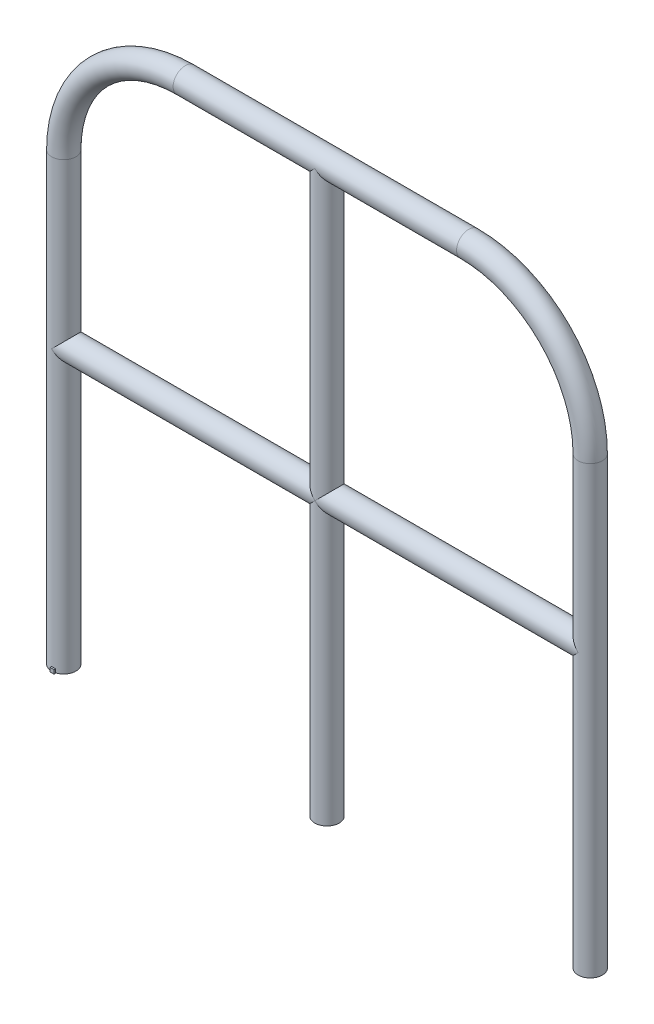
ISO-10303-21;
HEADER;
FILE_DESCRIPTION(('STEP AP214'),'2;1');
FILE_NAME('part.step','',(''),(''),'','','');
FILE_SCHEMA(('AUTOMOTIVE_DESIGN { 1 0 10303 214 1 1 1 1 }'));
ENDSEC;
DATA;
#1=APPLICATION_CONTEXT('core data for automotive mechanical design processes');
#2=APPLICATION_PROTOCOL_DEFINITION('international standard','automotive_design',2000,#1);
#3=PRODUCT_CONTEXT('',#1,'mechanical');
#4=PRODUCT('Part','Part','',(#3));
#5=PRODUCT_RELATED_PRODUCT_CATEGORY('part','',(#4));
#6=PRODUCT_DEFINITION_FORMATION('','',#4);
#7=PRODUCT_DEFINITION_CONTEXT('part definition',#1,'design');
#8=PRODUCT_DEFINITION('design','',#6,#7);
#9=PRODUCT_DEFINITION_SHAPE('','',#8);
#10=(LENGTH_UNIT() NAMED_UNIT(*) SI_UNIT(.MILLI.,.METRE.));
#11=(NAMED_UNIT(*) PLANE_ANGLE_UNIT() SI_UNIT($,.RADIAN.));
#12=(NAMED_UNIT(*) SI_UNIT($,.STERADIAN.) SOLID_ANGLE_UNIT());
#13=UNCERTAINTY_MEASURE_WITH_UNIT(LENGTH_MEASURE(1.E-05),#10,'distance_accuracy_value','');
#14=(GEOMETRIC_REPRESENTATION_CONTEXT(3) GLOBAL_UNCERTAINTY_ASSIGNED_CONTEXT((#13)) GLOBAL_UNIT_ASSIGNED_CONTEXT((#10,
#11,#12)) REPRESENTATION_CONTEXT('',''));
#15=CARTESIAN_POINT('',(0.,0.,0.));
#16=DIRECTION('',(0.,0.,1.));
#17=DIRECTION('',(1.,0.,0.));
#18=AXIS2_PLACEMENT_3D('',#15,#16,#17);
#19=CARTESIAN_POINT('',(2.6300843306164E-13,10.,30.));
#20=DIRECTION('',(-1.,0.,0.));
#21=DIRECTION('',(0.,-1.,0.));
#22=AXIS2_PLACEMENT_3D('',#19,#20,#21);
#23=PLANE('',#22);
#24=DIRECTION('',(0.,0.,-1.));
#25=VECTOR('',#24,1.);
#26=CARTESIAN_POINT('',(0.,0.,30.));
#27=LINE('',#26,#25);
#28=CARTESIAN_POINT('',(0.,0.,33.6166003880524));
#29=VERTEX_POINT('',#28);
#30=CARTESIAN_POINT('',(0.,0.,30.));
#31=VERTEX_POINT('',#30);
#32=EDGE_CURVE('E107',#29,#31,#27,.T.);
#33=ORIENTED_EDGE('',*,*,#32,.F.);
#34=DIRECTION('',(0.,-1.,0.));
#35=VECTOR('',#34,1.);
#36=CARTESIAN_POINT('',(2.6300843306164E-13,10.,33.6166003880524));
#37=LINE('',#36,#35);
#38=CARTESIAN_POINT('',(2.6300843306164E-13,10.,33.6166003880524));
#39=VERTEX_POINT('',#38);
#40=EDGE_CURVE('E12',#39,#29,#37,.T.);
#41=ORIENTED_EDGE('',*,*,#40,.F.);
#42=DIRECTION('',(0.,0.,-1.));
#43=VECTOR('',#42,1.);
#44=CARTESIAN_POINT('',(2.6300843306164E-13,10.,30.));
#45=LINE('',#44,#43);
#46=CARTESIAN_POINT('',(2.6300843306164E-13,10.,30.));
#47=VERTEX_POINT('',#46);
#48=EDGE_CURVE('E101',#39,#47,#45,.T.);
#49=ORIENTED_EDGE('',*,*,#48,.T.);
#50=DIRECTION('',(0.,-1.,0.));
#51=VECTOR('',#50,1.);
#52=CARTESIAN_POINT('',(2.6300843306164E-13,10.,30.));
#53=LINE('',#52,#51);
#54=EDGE_CURVE('E46',#47,#31,#53,.T.);
#55=ORIENTED_EDGE('',*,*,#54,.T.);
#56=EDGE_LOOP('',(#33,#41,#49,#55));
#57=FACE_BOUND('',#56,.T.);
#58=ADVANCED_FACE('F43',(#57),#23,.T.);
#59=CARTESIAN_POINT('',(2.6300843306164E-13,10.,33.6166003880524));
#60=DIRECTION('',(0.,0.,1.));
#61=DIRECTION('',(1.,0.,0.));
#62=AXIS2_PLACEMENT_3D('',#59,#60,#61);
#63=PLANE('',#62);
#64=DIRECTION('',(-1.,0.,0.));
#65=VECTOR('',#64,1.);
#66=CARTESIAN_POINT('',(0.,0.,33.6166003880524));
#67=LINE('',#66,#65);
#68=CARTESIAN_POINT('',(9.75705571428122,-2.56618793470822E-13,33.6166003880524));
#69=VERTEX_POINT('',#68);
#70=EDGE_CURVE('E103',#69,#29,#67,.T.);
#71=ORIENTED_EDGE('',*,*,#70,.F.);
#72=DIRECTION('',(0.,-1.,0.));
#73=VECTOR('',#72,1.);
#74=CARTESIAN_POINT('',(9.75705571428148,9.99999999999974,33.6166003880524));
#75=LINE('',#74,#73);
#76=CARTESIAN_POINT('',(9.75705571428148,9.99999999999974,33.6166003880524));
#77=VERTEX_POINT('',#76);
#78=EDGE_CURVE('E52',#77,#69,#75,.T.);
#79=ORIENTED_EDGE('',*,*,#78,.F.);
#80=DIRECTION('',(-1.,0.,0.));
#81=VECTOR('',#80,1.);
#82=CARTESIAN_POINT('',(2.6300843306164E-13,10.,33.6166003880524));
#83=LINE('',#82,#81);
#84=EDGE_CURVE('E98',#77,#39,#83,.T.);
#85=ORIENTED_EDGE('',*,*,#84,.T.);
#86=ORIENTED_EDGE('',*,*,#40,.T.);
#87=EDGE_LOOP('',(#71,#79,#85,#86));
#88=FACE_BOUND('',#87,.T.);
#89=ADVANCED_FACE('F117',(#88),#63,.T.);
#90=CARTESIAN_POINT('',(9.75705571428148,9.99999999999974,30.));
#91=DIRECTION('',(1.,0.,0.));
#92=DIRECTION('',(0.,1.,0.));
#93=AXIS2_PLACEMENT_3D('',#90,#91,#92);
#94=PLANE('',#93);
#95=DIRECTION('',(0.,0.,1.));
#96=VECTOR('',#95,1.);
#97=CARTESIAN_POINT('',(9.75705571428122,-2.56618793470822E-13,30.));
#98=LINE('',#97,#96);
#99=CARTESIAN_POINT('',(9.75705571428122,-2.56618793470822E-13,30.));
#100=VERTEX_POINT('',#99);
#101=EDGE_CURVE('E93',#100,#69,#98,.T.);
#102=ORIENTED_EDGE('',*,*,#101,.F.);
#103=DIRECTION('',(0.,-1.,0.));
#104=VECTOR('',#103,1.);
#105=CARTESIAN_POINT('',(9.75705571428148,9.99999999999974,30.));
#106=LINE('',#105,#104);
#107=CARTESIAN_POINT('',(9.75705571428148,9.99999999999974,30.));
#108=VERTEX_POINT('',#107);
#109=EDGE_CURVE('E88',#108,#100,#106,.T.);
#110=ORIENTED_EDGE('',*,*,#109,.F.);
#111=DIRECTION('',(0.,0.,1.));
#112=VECTOR('',#111,1.);
#113=CARTESIAN_POINT('',(9.75705571428148,9.99999999999974,30.));
#114=LINE('',#113,#112);
#115=EDGE_CURVE('E91',#108,#77,#114,.T.);
#116=ORIENTED_EDGE('',*,*,#115,.T.);
#117=ORIENTED_EDGE('',*,*,#78,.T.);
#118=EDGE_LOOP('',(#102,#110,#116,#117));
#119=FACE_BOUND('',#118,.T.);
#120=ADVANCED_FACE('F90',(#119),#94,.T.);
#121=CARTESIAN_POINT('',(2.6300843306164E-13,10.,30.));
#122=DIRECTION('',(0.,0.,-1.));
#123=DIRECTION('',(-1.,0.,0.));
#124=AXIS2_PLACEMENT_3D('',#121,#122,#123);
#125=PLANE('',#124);
#126=DIRECTION('',(1.,0.,0.));
#127=VECTOR('',#126,1.);
#128=CARTESIAN_POINT('',(0.,0.,30.));
#129=LINE('',#128,#127);
#130=EDGE_CURVE('E110',#31,#100,#129,.T.);
#131=ORIENTED_EDGE('',*,*,#130,.F.);
#132=ORIENTED_EDGE('',*,*,#54,.F.);
#133=DIRECTION('',(1.,0.,0.));
#134=VECTOR('',#133,1.);
#135=CARTESIAN_POINT('',(2.6300843306164E-13,10.,30.));
#136=LINE('',#135,#134);
#137=EDGE_CURVE('E97',#47,#108,#136,.T.);
#138=ORIENTED_EDGE('',*,*,#137,.T.);
#139=ORIENTED_EDGE('',*,*,#109,.T.);
#140=EDGE_LOOP('',(#131,#132,#138,#139));
#141=FACE_BOUND('',#140,.T.);
#142=ADVANCED_FACE('F100',(#141),#125,.T.);
#143=CARTESIAN_POINT('',(2.6300843306164E-13,10.,0.));
#144=DIRECTION('',(0.,1.,0.));
#145=DIRECTION('',(-1.,0.,0.));
#146=AXIS2_PLACEMENT_3D('',#143,#144,#145);
#147=PLANE('',#146);
#148=ORIENTED_EDGE('',*,*,#48,.F.);
#149=ORIENTED_EDGE('',*,*,#84,.F.);
#150=ORIENTED_EDGE('',*,*,#115,.F.);
#151=ORIENTED_EDGE('',*,*,#137,.F.);
#152=EDGE_LOOP('',(#148,#149,#150,#151));
#153=FACE_BOUND('',#152,.T.);
#154=ADVANCED_FACE('F96',(#153),#147,.T.);
#155=CARTESIAN_POINT('',(0.,0.,0.));
#156=DIRECTION('',(0.,1.,0.));
#157=DIRECTION('',(-1.,0.,0.));
#158=AXIS2_PLACEMENT_3D('',#155,#156,#157);
#159=PLANE('',#158);
#160=ORIENTED_EDGE('',*,*,#32,.T.);
#161=ORIENTED_EDGE('',*,*,#130,.T.);
#162=ORIENTED_EDGE('',*,*,#101,.T.);
#163=ORIENTED_EDGE('',*,*,#70,.T.);
#164=EDGE_LOOP('',(#160,#161,#162,#163));
#165=FACE_BOUND('',#164,.T.);
#166=ADVANCED_FACE('F116',(#165),#159,.F.);
#167=CLOSED_SHELL('',(#58,#89,#120,#142,#154,#166));
#168=MANIFOLD_SOLID_BREP('B2',#167);
#169=CARTESIAN_POINT('',(1300.,1100.,0.));
#170=DIRECTION('',(0.,-1.,0.));
#171=DIRECTION('',(0.,0.,-1.));
#172=AXIS2_PLACEMENT_3D('',#169,#170,#171);
#173=CYLINDRICAL_SURFACE('',#172,30.);
#174=CARTESIAN_POINT('',(1300.,2.22044604925031E-13,0.));
#175=DIRECTION('',(0.,-1.,0.));
#176=DIRECTION('',(0.,0.,1.));
#177=AXIS2_PLACEMENT_3D('',#174,#175,#176);
#178=CIRCLE('',#177,30.);
#179=CARTESIAN_POINT('',(1300.,2.22044604925031E-13,30.));
#180=VERTEX_POINT('',#179);
#181=EDGE_CURVE('E232',#180,#180,#178,.T.);
#182=ORIENTED_EDGE('',*,*,#181,.F.);
#183=EDGE_LOOP('',(#182));
#184=FACE_BOUND('',#183,.T.);
#185=CARTESIAN_POINT('',(1300.,1100.,0.));
#186=DIRECTION('',(0.,-1.,0.));
#187=DIRECTION('',(0.,0.,1.));
#188=AXIS2_PLACEMENT_3D('',#185,#186,#187);
#189=CIRCLE('',#188,30.);
#190=CARTESIAN_POINT('',(1330.,1100.,0.));
#191=VERTEX_POINT('',#190);
#192=EDGE_CURVE('E229',#191,#191,#189,.T.);
#193=ORIENTED_EDGE('',*,*,#192,.T.);
#194=EDGE_LOOP('',(#193));
#195=FACE_BOUND('',#194,.T.);
#196=CARTESIAN_POINT('',(1300.,689.391024166741,0.));
#197=DIRECTION('',(0.707106781186548,-0.707106781186547,0.));
#198=DIRECTION('',(-0.707106781186548,-0.707106781186547,0.));
#199=AXIS2_PLACEMENT_3D('',#196,#197,#198);
#200=ELLIPSE('',#199,42.4264068711929,30.);
#201=CARTESIAN_POINT('',(1300.,689.391024166741,30.));
#202=VERTEX_POINT('',#201);
#203=CARTESIAN_POINT('',(1300.,689.391024166741,-30.));
#204=VERTEX_POINT('',#203);
#205=EDGE_CURVE('E205',#202,#204,#200,.T.);
#206=ORIENTED_EDGE('',*,*,#205,.T.);
#207=CARTESIAN_POINT('',(1300.,689.391024166741,0.));
#208=DIRECTION('',(-0.707106781186548,-0.707106781186547,0.));
#209=DIRECTION('',(0.707106781186548,-0.707106781186547,0.));
#210=AXIS2_PLACEMENT_3D('',#207,#208,#209);
#211=ELLIPSE('',#210,42.4264068711929,30.);
#212=EDGE_CURVE('E187',#204,#202,#211,.F.);
#213=ORIENTED_EDGE('',*,*,#212,.T.);
#214=EDGE_LOOP('',(#206,#213));
#215=FACE_BOUND('',#214,.T.);
#216=ADVANCED_FACE('F167',(#184,#195,#215),#173,.T.);
#217=CARTESIAN_POINT('',(0.,1100.,0.));
#218=DIRECTION('',(0.,-1.,0.));
#219=DIRECTION('',(0.,0.,-1.));
#220=AXIS2_PLACEMENT_3D('',#217,#218,#219);
#221=CYLINDRICAL_SURFACE('',#220,30.);
#222=CARTESIAN_POINT('',(0.,0.,0.));
#223=DIRECTION('',(0.,1.,0.));
#224=DIRECTION('',(0.,0.,1.));
#225=AXIS2_PLACEMENT_3D('',#222,#223,#224);
#226=CIRCLE('',#225,30.);
#227=CARTESIAN_POINT('',(0.,0.,30.));
#228=VERTEX_POINT('',#227);
#229=EDGE_CURVE('E214',#228,#228,#226,.T.);
#230=ORIENTED_EDGE('',*,*,#229,.T.);
#231=EDGE_LOOP('',(#230));
#232=FACE_BOUND('',#231,.T.);
#233=CARTESIAN_POINT('',(0.,1100.,0.));
#234=DIRECTION('',(0.,1.,0.));
#235=DIRECTION('',(0.,0.,1.));
#236=AXIS2_PLACEMENT_3D('',#233,#234,#235);
#237=CIRCLE('',#236,30.);
#238=CARTESIAN_POINT('',(-30.,1100.,0.));
#239=VERTEX_POINT('',#238);
#240=EDGE_CURVE('E218',#239,#239,#237,.T.);
#241=ORIENTED_EDGE('',*,*,#240,.F.);
#242=EDGE_LOOP('',(#241));
#243=FACE_BOUND('',#242,.T.);
#244=CARTESIAN_POINT('',(0.,689.391024166741,0.));
#245=DIRECTION('',(-0.707106781186547,-0.707106781186547,0.));
#246=DIRECTION('',(0.707106781186547,-0.707106781186547,0.));
#247=AXIS2_PLACEMENT_3D('',#244,#245,#246);
#248=ELLIPSE('',#247,42.4264068711929,30.);
#249=CARTESIAN_POINT('',(0.,689.391024166741,30.));
#250=VERTEX_POINT('',#249);
#251=CARTESIAN_POINT('',(0.,689.391024166741,-30.));
#252=VERTEX_POINT('',#251);
#253=EDGE_CURVE('E209',#250,#252,#248,.F.);
#254=ORIENTED_EDGE('',*,*,#253,.F.);
#255=CARTESIAN_POINT('',(0.,689.391024166741,0.));
#256=DIRECTION('',(0.707106781186547,-0.707106781186547,0.));
#257=DIRECTION('',(-0.707106781186547,-0.707106781186547,0.));
#258=AXIS2_PLACEMENT_3D('',#255,#256,#257);
#259=ELLIPSE('',#258,42.4264068711929,30.);
#260=EDGE_CURVE('E366',#252,#250,#259,.T.);
#261=ORIENTED_EDGE('',*,*,#260,.F.);
#262=EDGE_LOOP('',(#254,#261));
#263=FACE_BOUND('',#262,.T.);
#264=ADVANCED_FACE('F265',(#232,#243,#263),#221,.T.);
#265=CARTESIAN_POINT('',(650.,1400.,0.));
#266=DIRECTION('',(0.,-1.,0.));
#267=DIRECTION('',(0.,0.,-1.));
#268=AXIS2_PLACEMENT_3D('',#265,#266,#267);
#269=CYLINDRICAL_SURFACE('',#268,30.);
#270=CARTESIAN_POINT('',(650.,1400.,0.));
#271=DIRECTION('',(0.707106781186547,-0.707106781186547,0.));
#272=DIRECTION('',(0.707106781186547,0.707106781186547,0.));
#273=AXIS2_PLACEMENT_3D('',#270,#271,#272);
#274=ELLIPSE('',#273,42.4264068711929,30.);
#275=CARTESIAN_POINT('',(650.,1400.,-30.));
#276=VERTEX_POINT('',#275);
#277=CARTESIAN_POINT('',(650.,1400.,30.));
#278=VERTEX_POINT('',#277);
#279=EDGE_CURVE('E238',#276,#278,#274,.F.);
#280=ORIENTED_EDGE('',*,*,#279,.F.);
#281=CARTESIAN_POINT('',(650.,1400.,0.));
#282=DIRECTION('',(0.707106781186547,0.707106781186547,0.));
#283=DIRECTION('',(0.707106781186547,-0.707106781186547,0.));
#284=AXIS2_PLACEMENT_3D('',#281,#282,#283);
#285=ELLIPSE('',#284,42.4264068711929,30.);
#286=EDGE_CURVE('E235',#278,#276,#285,.T.);
#287=ORIENTED_EDGE('',*,*,#286,.F.);
#288=EDGE_LOOP('',(#280,#287));
#289=FACE_BOUND('',#288,.T.);
#290=CARTESIAN_POINT('',(650.,689.391024166741,0.));
#291=DIRECTION('',(-0.707106781186547,-0.707106781186547,0.));
#292=DIRECTION('',(0.707106781186547,-0.707106781186547,0.));
#293=AXIS2_PLACEMENT_3D('',#290,#291,#292);
#294=ELLIPSE('',#293,42.4264068711929,30.);
#295=CARTESIAN_POINT('',(650.,689.391024166741,30.));
#296=VERTEX_POINT('',#295);
#297=CARTESIAN_POINT('',(650.,689.391024166741,-30.));
#298=VERTEX_POINT('',#297);
#299=EDGE_CURVE('E174',#296,#298,#294,.T.);
#300=ORIENTED_EDGE('',*,*,#299,.F.);
#301=CARTESIAN_POINT('',(650.,689.391024166741,0.));
#302=DIRECTION('',(0.707106781186547,-0.707106781186547,0.));
#303=DIRECTION('',(-0.707106781186547,-0.707106781186547,0.));
#304=AXIS2_PLACEMENT_3D('',#301,#302,#303);
#305=ELLIPSE('',#304,42.4264068711929,30.);
#306=EDGE_CURVE('E242',#298,#296,#305,.T.);
#307=ORIENTED_EDGE('',*,*,#306,.F.);
#308=EDGE_LOOP('',(#300,#307));
#309=FACE_BOUND('',#308,.T.);
#310=ADVANCED_FACE('F254',(#289,#309),#269,.T.);
#311=CARTESIAN_POINT('',(300.000000000002,1400.,0.));
#312=DIRECTION('',(1.,0.,0.));
#313=DIRECTION('',(0.,0.,-1.));
#314=AXIS2_PLACEMENT_3D('',#311,#312,#313);
#315=CYLINDRICAL_SURFACE('',#314,30.);
#316=CARTESIAN_POINT('',(999.999999999998,1400.,0.));
#317=DIRECTION('',(1.,0.,0.));
#318=DIRECTION('',(0.,0.,1.));
#319=AXIS2_PLACEMENT_3D('',#316,#317,#318);
#320=CIRCLE('',#319,30.);
#321=CARTESIAN_POINT('',(999.999999999998,1430.,0.));
#322=VERTEX_POINT('',#321);
#323=EDGE_CURVE('E226',#322,#322,#320,.T.);
#324=ORIENTED_EDGE('',*,*,#323,.F.);
#325=EDGE_LOOP('',(#324));
#326=FACE_BOUND('',#325,.T.);
#327=CARTESIAN_POINT('',(300.000000000002,1400.,0.));
#328=DIRECTION('',(1.,0.,0.));
#329=DIRECTION('',(0.,0.,1.));
#330=AXIS2_PLACEMENT_3D('',#327,#328,#329);
#331=CIRCLE('',#330,30.);
#332=CARTESIAN_POINT('',(300.000000000002,1430.,0.));
#333=VERTEX_POINT('',#332);
#334=EDGE_CURVE('E221',#333,#333,#331,.T.);
#335=ORIENTED_EDGE('',*,*,#334,.T.);
#336=EDGE_LOOP('',(#335));
#337=FACE_BOUND('',#336,.T.);
#338=ORIENTED_EDGE('',*,*,#286,.T.);
#339=ORIENTED_EDGE('',*,*,#279,.T.);
#340=EDGE_LOOP('',(#338,#339));
#341=FACE_BOUND('',#340,.T.);
#342=ADVANCED_FACE('F264',(#326,#337,#341),#315,.T.);
#343=CARTESIAN_POINT('',(1000.,1100.,0.));
#344=DIRECTION('',(0.,0.,-1.));
#345=DIRECTION('',(-1.,0.,0.));
#346=AXIS2_PLACEMENT_3D('',#343,#344,#345);
#347=TOROIDAL_SURFACE('',#346,300.,30.);
#348=CARTESIAN_POINT('',(1000.,1100.,0.));
#349=DIRECTION('',(0.,0.,-1.));
#350=DIRECTION('',(-1.,0.,0.));
#351=AXIS2_PLACEMENT_3D('',#348,#349,#350);
#352=CIRCLE('',#351,330.);
#353=EDGE_CURVE('',#322,#191,#352,.T.);
#354=ORIENTED_EDGE('',*,*,#323,.T.);
#355=ORIENTED_EDGE('',*,*,#192,.F.);
#356=ORIENTED_EDGE('',*,*,#353,.T.);
#357=ORIENTED_EDGE('',*,*,#353,.F.);
#358=EDGE_LOOP('',(#354,#356,#355,#357));
#359=FACE_BOUND('',#358,.T.);
#360=ADVANCED_FACE('F278',(#359),#347,.T.);
#361=CARTESIAN_POINT('',(300.,1100.,0.));
#362=DIRECTION('',(0.,0.,-1.));
#363=DIRECTION('',(-1.,0.,0.));
#364=AXIS2_PLACEMENT_3D('',#361,#362,#363);
#365=TOROIDAL_SURFACE('',#364,300.,30.);
#366=CARTESIAN_POINT('',(300.,1100.,0.));
#367=DIRECTION('',(0.,0.,-1.));
#368=DIRECTION('',(-1.,0.,0.));
#369=AXIS2_PLACEMENT_3D('',#366,#367,#368);
#370=CIRCLE('',#369,330.);
#371=EDGE_CURVE('',#239,#333,#370,.T.);
#372=ORIENTED_EDGE('',*,*,#240,.T.);
#373=ORIENTED_EDGE('',*,*,#334,.F.);
#374=ORIENTED_EDGE('',*,*,#371,.T.);
#375=ORIENTED_EDGE('',*,*,#371,.F.);
#376=EDGE_LOOP('',(#372,#374,#373,#375));
#377=FACE_BOUND('',#376,.T.);
#378=ADVANCED_FACE('F280',(#377),#365,.T.);
#379=CARTESIAN_POINT('',(1300.,2.22044604925031E-13,0.));
#380=DIRECTION('',(0.,-1.,0.));
#381=DIRECTION('',(0.,0.,1.));
#382=AXIS2_PLACEMENT_3D('',#379,#380,#381);
#383=PLANE('',#382);
#384=ORIENTED_EDGE('',*,*,#181,.T.);
#385=EDGE_LOOP('',(#384));
#386=FACE_BOUND('',#385,.T.);
#387=ADVANCED_FACE('F286',(#386),#383,.T.);
#388=CARTESIAN_POINT('',(0.,0.,0.));
#389=DIRECTION('',(0.,1.,0.));
#390=DIRECTION('',(0.,0.,1.));
#391=AXIS2_PLACEMENT_3D('',#388,#389,#390);
#392=PLANE('',#391);
#393=ORIENTED_EDGE('',*,*,#229,.F.);
#394=EDGE_LOOP('',(#393));
#395=FACE_BOUND('',#394,.T.);
#396=ADVANCED_FACE('F292',(#395),#392,.F.);
#397=CARTESIAN_POINT('',(1300.,689.391024166741,0.));
#398=DIRECTION('',(-1.,0.,0.));
#399=DIRECTION('',(0.,0.,1.));
#400=AXIS2_PLACEMENT_3D('',#397,#398,#399);
#401=CYLINDRICAL_SURFACE('',#400,30.);
#402=CARTESIAN_POINT('',(650.,689.391024166741,0.));
#403=DIRECTION('',(0.707106781186547,-0.707106781186547,0.));
#404=DIRECTION('',(-0.707106781186547,-0.707106781186547,0.));
#405=AXIS2_PLACEMENT_3D('',#402,#403,#404);
#406=ELLIPSE('',#405,42.4264068711929,30.);
#407=EDGE_CURVE('E180',#298,#296,#406,.F.);
#408=ORIENTED_EDGE('',*,*,#407,.T.);
#409=ORIENTED_EDGE('',*,*,#299,.T.);
#410=EDGE_LOOP('',(#408,#409));
#411=FACE_BOUND('',#410,.T.);
#412=ORIENTED_EDGE('',*,*,#260,.T.);
#413=ORIENTED_EDGE('',*,*,#253,.T.);
#414=EDGE_LOOP('',(#412,#413));
#415=FACE_BOUND('',#414,.T.);
#416=ADVANCED_FACE('F245',(#411,#415),#401,.T.);
#417=CARTESIAN_POINT('',(650.,0.,0.));
#418=DIRECTION('',(0.,1.,0.));
#419=DIRECTION('',(0.,0.,1.));
#420=AXIS2_PLACEMENT_3D('',#417,#418,#419);
#421=PLANE('',#420);
#422=CARTESIAN_POINT('',(650.,0.,0.));
#423=DIRECTION('',(0.,1.,0.));
#424=DIRECTION('',(0.,0.,1.));
#425=AXIS2_PLACEMENT_3D('',#422,#423,#424);
#426=CIRCLE('',#425,30.);
#427=CARTESIAN_POINT('',(650.,0.,30.));
#428=VERTEX_POINT('',#427);
#429=EDGE_CURVE('E211',#428,#428,#426,.T.);
#430=ORIENTED_EDGE('',*,*,#429,.F.);
#431=EDGE_LOOP('',(#430));
#432=FACE_BOUND('',#431,.T.);
#433=ADVANCED_FACE('F251',(#432),#421,.F.);
#434=ORIENTED_EDGE('',*,*,#429,.T.);
#435=EDGE_LOOP('',(#434));
#436=FACE_BOUND('',#435,.T.);
#437=CARTESIAN_POINT('',(650.,689.391024166741,0.));
#438=DIRECTION('',(-0.707106781186547,-0.707106781186547,0.));
#439=DIRECTION('',(0.707106781186547,-0.707106781186547,0.));
#440=AXIS2_PLACEMENT_3D('',#437,#438,#439);
#441=ELLIPSE('',#440,42.4264068711929,30.);
#442=EDGE_CURVE('E41',#296,#298,#441,.F.);
#443=ORIENTED_EDGE('',*,*,#442,.F.);
#444=ORIENTED_EDGE('',*,*,#407,.F.);
#445=EDGE_LOOP('',(#443,#444));
#446=FACE_BOUND('',#445,.T.);
#447=ADVANCED_FACE('F249',(#436,#446),#269,.T.);
#448=ORIENTED_EDGE('',*,*,#212,.F.);
#449=ORIENTED_EDGE('',*,*,#205,.F.);
#450=EDGE_LOOP('',(#448,#449));
#451=FACE_BOUND('',#450,.T.);
#452=ORIENTED_EDGE('',*,*,#306,.T.);
#453=ORIENTED_EDGE('',*,*,#442,.T.);
#454=EDGE_LOOP('',(#452,#453));
#455=FACE_BOUND('',#454,.T.);
#456=ADVANCED_FACE('F206',(#451,#455),#401,.T.);
#457=CLOSED_SHELL('',(#216,#264,#310,#342,#360,#378,#387,#396,#416,#433,#447,#456));
#458=MANIFOLD_SOLID_BREP('B6',#457);
#459=ADVANCED_BREP_SHAPE_REPRESENTATION('',(#18,#168,#458),#14);
#460=SHAPE_DEFINITION_REPRESENTATION(#9,#459);
ENDSEC;
END-ISO-10303-21;
